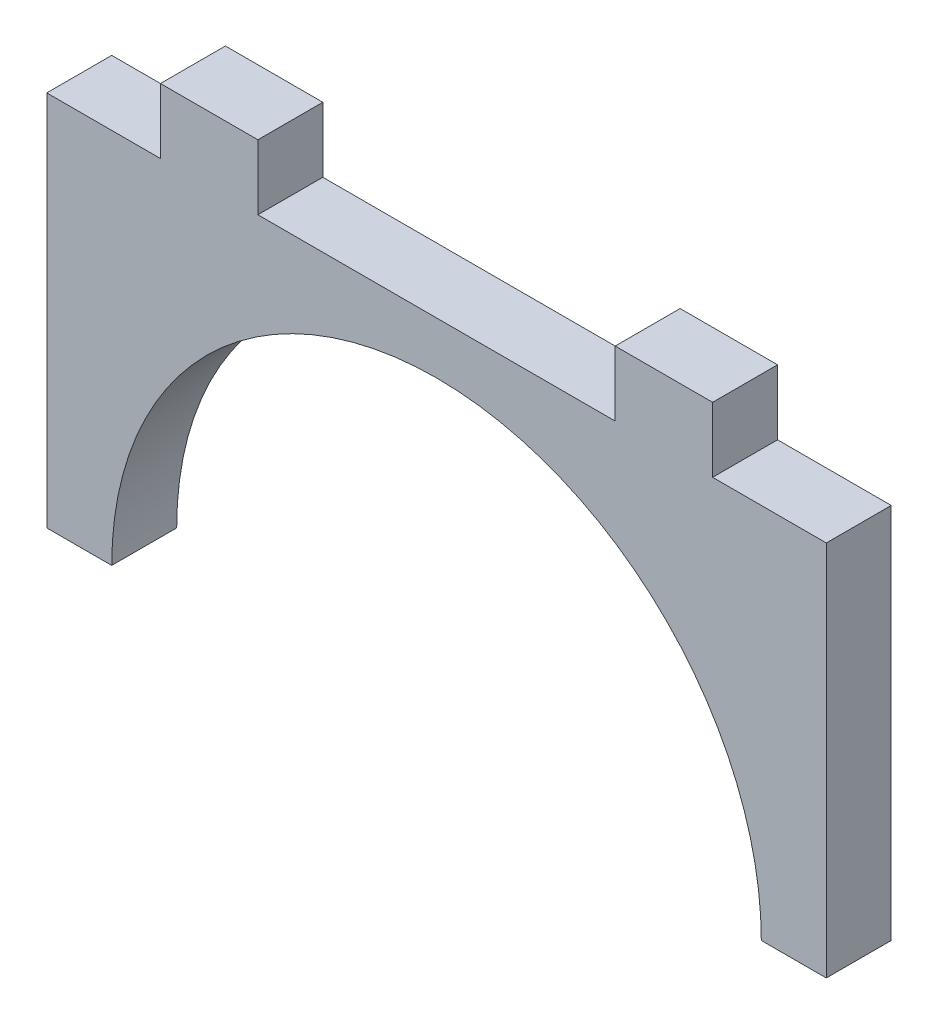
ISO-10303-21;
HEADER;
FILE_DESCRIPTION(('STEP AP214'),'2;1');
FILE_NAME('part.step','',(''),(''),'','','');
FILE_SCHEMA(('AUTOMOTIVE_DESIGN { 1 0 10303 214 1 1 1 1 }'));
ENDSEC;
DATA;
#1=APPLICATION_CONTEXT('core data for automotive mechanical design processes');
#2=APPLICATION_PROTOCOL_DEFINITION('international standard','automotive_design',2000,#1);
#3=PRODUCT_CONTEXT('',#1,'mechanical');
#4=PRODUCT('Part','Part','',(#3));
#5=PRODUCT_RELATED_PRODUCT_CATEGORY('part','',(#4));
#6=PRODUCT_DEFINITION_FORMATION('','',#4);
#7=PRODUCT_DEFINITION_CONTEXT('part definition',#1,'design');
#8=PRODUCT_DEFINITION('design','',#6,#7);
#9=PRODUCT_DEFINITION_SHAPE('','',#8);
#10=(LENGTH_UNIT() NAMED_UNIT(*) SI_UNIT(.MILLI.,.METRE.));
#11=(NAMED_UNIT(*) PLANE_ANGLE_UNIT() SI_UNIT($,.RADIAN.));
#12=(NAMED_UNIT(*) SI_UNIT($,.STERADIAN.) SOLID_ANGLE_UNIT());
#13=UNCERTAINTY_MEASURE_WITH_UNIT(LENGTH_MEASURE(1.E-05),#10,'distance_accuracy_value','');
#14=(GEOMETRIC_REPRESENTATION_CONTEXT(3) GLOBAL_UNCERTAINTY_ASSIGNED_CONTEXT((#13)) GLOBAL_UNIT_ASSIGNED_CONTEXT((#10,
#11,#12)) REPRESENTATION_CONTEXT('',''));
#15=CARTESIAN_POINT('',(0.,0.,0.));
#16=DIRECTION('',(0.,0.,1.));
#17=DIRECTION('',(1.,0.,0.));
#18=AXIS2_PLACEMENT_3D('',#15,#16,#17);
#19=CARTESIAN_POINT('',(0.,142.24,-12.7));
#20=DIRECTION('',(0.,0.,1.));
#21=DIRECTION('',(1.,0.,0.));
#22=AXIS2_PLACEMENT_3D('',#19,#20,#21);
#23=CYLINDRICAL_SURFACE('',#22,63.5);
#24=CARTESIAN_POINT('',(0.,142.24,0.));
#25=DIRECTION('',(0.,0.,1.));
#26=DIRECTION('',(1.,0.,0.));
#27=AXIS2_PLACEMENT_3D('',#24,#25,#26);
#28=CIRCLE('',#27,63.5);
#29=CARTESIAN_POINT('',(63.5,142.24,0.));
#30=VERTEX_POINT('',#29);
#31=CARTESIAN_POINT('',(-63.5,142.24,0.));
#32=VERTEX_POINT('',#31);
#33=EDGE_CURVE('E165',#30,#32,#28,.T.);
#34=ORIENTED_EDGE('',*,*,#33,.T.);
#35=DIRECTION('',(0.,0.,1.));
#36=VECTOR('',#35,1.);
#37=CARTESIAN_POINT('',(-63.5,142.24,-12.7));
#38=LINE('',#37,#36);
#39=CARTESIAN_POINT('',(-63.5,142.24,-12.7));
#40=VERTEX_POINT('',#39);
#41=EDGE_CURVE('E11',#40,#32,#38,.T.);
#42=ORIENTED_EDGE('',*,*,#41,.F.);
#43=CARTESIAN_POINT('',(0.,142.24,-12.7));
#44=DIRECTION('',(0.,0.,1.));
#45=DIRECTION('',(1.,0.,0.));
#46=AXIS2_PLACEMENT_3D('',#43,#44,#45);
#47=CIRCLE('',#46,63.5);
#48=CARTESIAN_POINT('',(63.5,142.24,-12.7));
#49=VERTEX_POINT('',#48);
#50=EDGE_CURVE('E198',#49,#40,#47,.T.);
#51=ORIENTED_EDGE('',*,*,#50,.F.);
#52=DIRECTION('',(0.,0.,1.));
#53=VECTOR('',#52,1.);
#54=CARTESIAN_POINT('',(63.5,142.24,-12.7));
#55=LINE('',#54,#53);
#56=EDGE_CURVE('E36',#49,#30,#55,.T.);
#57=ORIENTED_EDGE('',*,*,#56,.T.);
#58=EDGE_LOOP('',(#34,#42,#51,#57));
#59=FACE_BOUND('',#58,.T.);
#60=ADVANCED_FACE('F33',(#59),#23,.F.);
#61=CARTESIAN_POINT('',(-0.549995359405287,142.24,-12.7));
#62=DIRECTION('',(0.,1.,0.));
#63=DIRECTION('',(0.,0.,1.));
#64=AXIS2_PLACEMENT_3D('',#61,#62,#63);
#65=PLANE('',#64);
#66=DIRECTION('',(-1.,0.,0.));
#67=VECTOR('',#66,1.);
#68=CARTESIAN_POINT('',(-0.549995359405287,142.24,0.));
#69=LINE('',#68,#67);
#70=CARTESIAN_POINT('',(-76.2,142.24,0.));
#71=VERTEX_POINT('',#70);
#72=EDGE_CURVE('E94',#32,#71,#69,.T.);
#73=ORIENTED_EDGE('',*,*,#72,.T.);
#74=DIRECTION('',(0.,0.,1.));
#75=VECTOR('',#74,1.);
#76=CARTESIAN_POINT('',(-76.2,142.24,-12.7));
#77=LINE('',#76,#75);
#78=CARTESIAN_POINT('',(-76.2,142.24,-12.7));
#79=VERTEX_POINT('',#78);
#80=EDGE_CURVE('E42',#79,#71,#77,.T.);
#81=ORIENTED_EDGE('',*,*,#80,.F.);
#82=DIRECTION('',(-1.,0.,0.));
#83=VECTOR('',#82,1.);
#84=CARTESIAN_POINT('',(-0.549995359405287,142.24,-12.7));
#85=LINE('',#84,#83);
#86=EDGE_CURVE('E50',#40,#79,#85,.T.);
#87=ORIENTED_EDGE('',*,*,#86,.F.);
#88=ORIENTED_EDGE('',*,*,#41,.T.);
#89=EDGE_LOOP('',(#73,#81,#87,#88));
#90=FACE_BOUND('',#89,.T.);
#91=ADVANCED_FACE('F286',(#90),#65,.F.);
#92=CARTESIAN_POINT('',(-76.2,46.5973488707267,-12.7));
#93=DIRECTION('',(1.,0.,0.));
#94=DIRECTION('',(0.,1.,0.));
#95=AXIS2_PLACEMENT_3D('',#92,#93,#94);
#96=PLANE('',#95);
#97=DIRECTION('',(0.,1.,0.));
#98=VECTOR('',#97,1.);
#99=CARTESIAN_POINT('',(-76.2,46.5973488707267,0.));
#100=LINE('',#99,#98);
#101=CARTESIAN_POINT('',(-76.2,215.9,0.));
#102=VERTEX_POINT('',#101);
#103=EDGE_CURVE('E150',#71,#102,#100,.T.);
#104=ORIENTED_EDGE('',*,*,#103,.T.);
#105=DIRECTION('',(0.,0.,1.));
#106=VECTOR('',#105,1.);
#107=CARTESIAN_POINT('',(-76.2,215.9,-12.7));
#108=LINE('',#107,#106);
#109=CARTESIAN_POINT('',(-76.2,215.9,-12.7));
#110=VERTEX_POINT('',#109);
#111=EDGE_CURVE('E148',#110,#102,#108,.T.);
#112=ORIENTED_EDGE('',*,*,#111,.F.);
#113=DIRECTION('',(0.,1.,0.));
#114=VECTOR('',#113,1.);
#115=CARTESIAN_POINT('',(-76.2,46.5973488707267,-12.7));
#116=LINE('',#115,#114);
#117=EDGE_CURVE('E140',#79,#110,#116,.T.);
#118=ORIENTED_EDGE('',*,*,#117,.F.);
#119=ORIENTED_EDGE('',*,*,#80,.T.);
#120=EDGE_LOOP('',(#104,#112,#118,#119));
#121=FACE_BOUND('',#120,.T.);
#122=ADVANCED_FACE('F149',(#121),#96,.F.);
#123=CARTESIAN_POINT('',(-0.54999535940571,215.9,-12.7));
#124=DIRECTION('',(0.,1.,0.));
#125=DIRECTION('',(-1.,0.,0.));
#126=AXIS2_PLACEMENT_3D('',#123,#124,#125);
#127=PLANE('',#126);
#128=DIRECTION('',(-1.,0.,0.));
#129=VECTOR('',#128,1.);
#130=CARTESIAN_POINT('',(-0.54999535940571,215.9,0.));
#131=LINE('',#130,#129);
#132=CARTESIAN_POINT('',(-53.975,215.9,0.));
#133=VERTEX_POINT('',#132);
#134=EDGE_CURVE('E195',#133,#102,#131,.T.);
#135=ORIENTED_EDGE('',*,*,#134,.F.);
#136=DIRECTION('',(0.,0.,1.));
#137=VECTOR('',#136,1.);
#138=CARTESIAN_POINT('',(-53.975,215.9,-12.7));
#139=LINE('',#138,#137);
#140=CARTESIAN_POINT('',(-53.975,215.9,-12.7));
#141=VERTEX_POINT('',#140);
#142=EDGE_CURVE('E154',#141,#133,#139,.T.);
#143=ORIENTED_EDGE('',*,*,#142,.F.);
#144=DIRECTION('',(-1.,0.,0.));
#145=VECTOR('',#144,1.);
#146=CARTESIAN_POINT('',(-0.54999535940571,215.9,-12.7));
#147=LINE('',#146,#145);
#148=EDGE_CURVE('E144',#141,#110,#147,.T.);
#149=ORIENTED_EDGE('',*,*,#148,.T.);
#150=ORIENTED_EDGE('',*,*,#111,.T.);
#151=EDGE_LOOP('',(#135,#143,#149,#150));
#152=FACE_BOUND('',#151,.T.);
#153=ADVANCED_FACE('F156',(#152),#127,.T.);
#154=CARTESIAN_POINT('',(-53.9749999999999,46.5973488707266,-12.7));
#155=DIRECTION('',(1.,0.,0.));
#156=DIRECTION('',(0.,1.,0.));
#157=AXIS2_PLACEMENT_3D('',#154,#155,#156);
#158=PLANE('',#157);
#159=DIRECTION('',(0.,1.,0.));
#160=VECTOR('',#159,1.);
#161=CARTESIAN_POINT('',(-53.9749999999999,46.5973488707266,0.));
#162=LINE('',#161,#160);
#163=CARTESIAN_POINT('',(-53.975,228.6,0.));
#164=VERTEX_POINT('',#163);
#165=EDGE_CURVE('E193',#133,#164,#162,.T.);
#166=ORIENTED_EDGE('',*,*,#165,.T.);
#167=DIRECTION('',(0.,0.,1.));
#168=VECTOR('',#167,1.);
#169=CARTESIAN_POINT('',(-53.975,228.6,-12.7));
#170=LINE('',#169,#168);
#171=CARTESIAN_POINT('',(-53.975,228.6,-12.7));
#172=VERTEX_POINT('',#171);
#173=EDGE_CURVE('E202',#172,#164,#170,.T.);
#174=ORIENTED_EDGE('',*,*,#173,.F.);
#175=DIRECTION('',(0.,1.,0.));
#176=VECTOR('',#175,1.);
#177=CARTESIAN_POINT('',(-53.9749999999999,46.5973488707266,-12.7));
#178=LINE('',#177,#176);
#179=EDGE_CURVE('E158',#141,#172,#178,.T.);
#180=ORIENTED_EDGE('',*,*,#179,.F.);
#181=ORIENTED_EDGE('',*,*,#142,.T.);
#182=EDGE_LOOP('',(#166,#174,#180,#181));
#183=FACE_BOUND('',#182,.T.);
#184=ADVANCED_FACE('F274',(#183),#158,.F.);
#185=CARTESIAN_POINT('',(-0.549995359405287,228.6,-12.7));
#186=DIRECTION('',(0.,-1.,0.));
#187=DIRECTION('',(0.,0.,-1.));
#188=AXIS2_PLACEMENT_3D('',#185,#186,#187);
#189=PLANE('',#188);
#190=DIRECTION('',(1.,0.,0.));
#191=VECTOR('',#190,1.);
#192=CARTESIAN_POINT('',(-0.549995359405287,228.6,0.));
#193=LINE('',#192,#191);
#194=CARTESIAN_POINT('',(-34.925,228.6,0.));
#195=VERTEX_POINT('',#194);
#196=EDGE_CURVE('E190',#164,#195,#193,.T.);
#197=ORIENTED_EDGE('',*,*,#196,.T.);
#198=DIRECTION('',(0.,0.,1.));
#199=VECTOR('',#198,1.);
#200=CARTESIAN_POINT('',(-34.925,228.6,-12.7));
#201=LINE('',#200,#199);
#202=CARTESIAN_POINT('',(-34.925,228.6,-12.7));
#203=VERTEX_POINT('',#202);
#204=EDGE_CURVE('E205',#203,#195,#201,.T.);
#205=ORIENTED_EDGE('',*,*,#204,.F.);
#206=DIRECTION('',(1.,0.,0.));
#207=VECTOR('',#206,1.);
#208=CARTESIAN_POINT('',(-0.549995359405287,228.6,-12.7));
#209=LINE('',#208,#207);
#210=EDGE_CURVE('E160',#172,#203,#209,.T.);
#211=ORIENTED_EDGE('',*,*,#210,.F.);
#212=ORIENTED_EDGE('',*,*,#173,.T.);
#213=EDGE_LOOP('',(#197,#205,#211,#212));
#214=FACE_BOUND('',#213,.T.);
#215=ADVANCED_FACE('F270',(#214),#189,.F.);
#216=CARTESIAN_POINT('',(-34.925,46.5973488707267,-12.7));
#217=DIRECTION('',(1.,0.,0.));
#218=DIRECTION('',(0.,0.,-1.));
#219=AXIS2_PLACEMENT_3D('',#216,#217,#218);
#220=PLANE('',#219);
#221=DIRECTION('',(0.,1.,0.));
#222=VECTOR('',#221,1.);
#223=CARTESIAN_POINT('',(-34.925,46.5973488707267,0.));
#224=LINE('',#223,#222);
#225=CARTESIAN_POINT('',(-34.925,215.9,0.));
#226=VERTEX_POINT('',#225);
#227=EDGE_CURVE('E187',#226,#195,#224,.T.);
#228=ORIENTED_EDGE('',*,*,#227,.F.);
#229=DIRECTION('',(0.,0.,1.));
#230=VECTOR('',#229,1.);
#231=CARTESIAN_POINT('',(-34.925,215.9,-12.7));
#232=LINE('',#231,#230);
#233=CARTESIAN_POINT('',(-34.925,215.9,-12.7));
#234=VERTEX_POINT('',#233);
#235=EDGE_CURVE('E207',#234,#226,#232,.T.);
#236=ORIENTED_EDGE('',*,*,#235,.F.);
#237=DIRECTION('',(0.,1.,0.));
#238=VECTOR('',#237,1.);
#239=CARTESIAN_POINT('',(-34.925,46.5973488707267,-12.7));
#240=LINE('',#239,#238);
#241=EDGE_CURVE('E275',#234,#203,#240,.T.);
#242=ORIENTED_EDGE('',*,*,#241,.T.);
#243=ORIENTED_EDGE('',*,*,#204,.T.);
#244=EDGE_LOOP('',(#228,#236,#242,#243));
#245=FACE_BOUND('',#244,.T.);
#246=ADVANCED_FACE('F265',(#245),#220,.T.);
#247=CARTESIAN_POINT('',(-0.549995359405287,215.9,-12.7));
#248=DIRECTION('',(0.,1.,0.));
#249=DIRECTION('',(0.,0.,1.));
#250=AXIS2_PLACEMENT_3D('',#247,#248,#249);
#251=PLANE('',#250);
#252=DIRECTION('',(-1.,0.,0.));
#253=VECTOR('',#252,1.);
#254=CARTESIAN_POINT('',(-0.549995359405287,215.9,0.));
#255=LINE('',#254,#253);
#256=CARTESIAN_POINT('',(34.925,215.9,0.));
#257=VERTEX_POINT('',#256);
#258=EDGE_CURVE('E184',#257,#226,#255,.T.);
#259=ORIENTED_EDGE('',*,*,#258,.F.);
#260=DIRECTION('',(0.,0.,1.));
#261=VECTOR('',#260,1.);
#262=CARTESIAN_POINT('',(34.925,215.9,-12.7));
#263=LINE('',#262,#261);
#264=CARTESIAN_POINT('',(34.925,215.9,-12.7));
#265=VERTEX_POINT('',#264);
#266=EDGE_CURVE('E209',#265,#257,#263,.T.);
#267=ORIENTED_EDGE('',*,*,#266,.F.);
#268=DIRECTION('',(-1.,0.,0.));
#269=VECTOR('',#268,1.);
#270=CARTESIAN_POINT('',(-0.549995359405287,215.9,-12.7));
#271=LINE('',#270,#269);
#272=EDGE_CURVE('E261',#265,#234,#271,.T.);
#273=ORIENTED_EDGE('',*,*,#272,.T.);
#274=ORIENTED_EDGE('',*,*,#235,.T.);
#275=EDGE_LOOP('',(#259,#267,#273,#274));
#276=FACE_BOUND('',#275,.T.);
#277=ADVANCED_FACE('F258',(#276),#251,.T.);
#278=CARTESIAN_POINT('',(34.925,46.5973488707267,-12.7));
#279=DIRECTION('',(1.,0.,0.));
#280=DIRECTION('',(0.,0.,-1.));
#281=AXIS2_PLACEMENT_3D('',#278,#279,#280);
#282=PLANE('',#281);
#283=DIRECTION('',(0.,1.,0.));
#284=VECTOR('',#283,1.);
#285=CARTESIAN_POINT('',(34.925,46.5973488707267,0.));
#286=LINE('',#285,#284);
#287=CARTESIAN_POINT('',(34.925,228.6,0.));
#288=VERTEX_POINT('',#287);
#289=EDGE_CURVE('E182',#257,#288,#286,.T.);
#290=ORIENTED_EDGE('',*,*,#289,.T.);
#291=DIRECTION('',(0.,0.,1.));
#292=VECTOR('',#291,1.);
#293=CARTESIAN_POINT('',(34.925,228.6,-12.7));
#294=LINE('',#293,#292);
#295=CARTESIAN_POINT('',(34.925,228.6,-12.7));
#296=VERTEX_POINT('',#295);
#297=EDGE_CURVE('E211',#296,#288,#294,.T.);
#298=ORIENTED_EDGE('',*,*,#297,.F.);
#299=DIRECTION('',(0.,1.,0.));
#300=VECTOR('',#299,1.);
#301=CARTESIAN_POINT('',(34.925,46.5973488707267,-12.7));
#302=LINE('',#301,#300);
#303=EDGE_CURVE('E254',#265,#296,#302,.T.);
#304=ORIENTED_EDGE('',*,*,#303,.F.);
#305=ORIENTED_EDGE('',*,*,#266,.T.);
#306=EDGE_LOOP('',(#290,#298,#304,#305));
#307=FACE_BOUND('',#306,.T.);
#308=ADVANCED_FACE('F253',(#307),#282,.F.);
#309=CARTESIAN_POINT('',(-0.549995359405287,228.6,-12.7));
#310=DIRECTION('',(0.,-1.,0.));
#311=DIRECTION('',(0.,0.,-1.));
#312=AXIS2_PLACEMENT_3D('',#309,#310,#311);
#313=PLANE('',#312);
#314=DIRECTION('',(1.,0.,0.));
#315=VECTOR('',#314,1.);
#316=CARTESIAN_POINT('',(-0.549995359405287,228.6,0.));
#317=LINE('',#316,#315);
#318=CARTESIAN_POINT('',(53.975,228.6,0.));
#319=VERTEX_POINT('',#318);
#320=EDGE_CURVE('E179',#288,#319,#317,.T.);
#321=ORIENTED_EDGE('',*,*,#320,.T.);
#322=DIRECTION('',(0.,0.,1.));
#323=VECTOR('',#322,1.);
#324=CARTESIAN_POINT('',(53.975,228.6,-12.7));
#325=LINE('',#324,#323);
#326=CARTESIAN_POINT('',(53.975,228.6,-12.7));
#327=VERTEX_POINT('',#326);
#328=EDGE_CURVE('E214',#327,#319,#325,.T.);
#329=ORIENTED_EDGE('',*,*,#328,.F.);
#330=DIRECTION('',(1.,0.,0.));
#331=VECTOR('',#330,1.);
#332=CARTESIAN_POINT('',(-0.549995359405287,228.6,-12.7));
#333=LINE('',#332,#331);
#334=EDGE_CURVE('E250',#296,#327,#333,.T.);
#335=ORIENTED_EDGE('',*,*,#334,.F.);
#336=ORIENTED_EDGE('',*,*,#297,.T.);
#337=EDGE_LOOP('',(#321,#329,#335,#336));
#338=FACE_BOUND('',#337,.T.);
#339=ADVANCED_FACE('F248',(#338),#313,.F.);
#340=CARTESIAN_POINT('',(53.975,46.5973488707267,-12.7));
#341=DIRECTION('',(1.,0.,0.));
#342=DIRECTION('',(0.,0.,-1.));
#343=AXIS2_PLACEMENT_3D('',#340,#341,#342);
#344=PLANE('',#343);
#345=DIRECTION('',(0.,1.,0.));
#346=VECTOR('',#345,1.);
#347=CARTESIAN_POINT('',(53.975,46.5973488707267,0.));
#348=LINE('',#347,#346);
#349=CARTESIAN_POINT('',(53.975,215.9,0.));
#350=VERTEX_POINT('',#349);
#351=EDGE_CURVE('E176',#350,#319,#348,.T.);
#352=ORIENTED_EDGE('',*,*,#351,.F.);
#353=DIRECTION('',(0.,0.,1.));
#354=VECTOR('',#353,1.);
#355=CARTESIAN_POINT('',(53.975,215.9,-12.7));
#356=LINE('',#355,#354);
#357=CARTESIAN_POINT('',(53.975,215.9,-12.7));
#358=VERTEX_POINT('',#357);
#359=EDGE_CURVE('E216',#358,#350,#356,.T.);
#360=ORIENTED_EDGE('',*,*,#359,.F.);
#361=DIRECTION('',(0.,1.,0.));
#362=VECTOR('',#361,1.);
#363=CARTESIAN_POINT('',(53.975,46.5973488707267,-12.7));
#364=LINE('',#363,#362);
#365=EDGE_CURVE('E245',#358,#327,#364,.T.);
#366=ORIENTED_EDGE('',*,*,#365,.T.);
#367=ORIENTED_EDGE('',*,*,#328,.T.);
#368=EDGE_LOOP('',(#352,#360,#366,#367));
#369=FACE_BOUND('',#368,.T.);
#370=ADVANCED_FACE('F241',(#369),#344,.T.);
#371=CARTESIAN_POINT('',(-0.549995359405076,215.9,-12.7));
#372=DIRECTION('',(0.,1.,0.));
#373=DIRECTION('',(-1.,0.,0.));
#374=AXIS2_PLACEMENT_3D('',#371,#372,#373);
#375=PLANE('',#374);
#376=DIRECTION('',(-1.,0.,0.));
#377=VECTOR('',#376,1.);
#378=CARTESIAN_POINT('',(-0.549995359405076,215.9,0.));
#379=LINE('',#378,#377);
#380=CARTESIAN_POINT('',(76.2,215.9,0.));
#381=VERTEX_POINT('',#380);
#382=EDGE_CURVE('E173',#381,#350,#379,.T.);
#383=ORIENTED_EDGE('',*,*,#382,.F.);
#384=DIRECTION('',(0.,0.,1.));
#385=VECTOR('',#384,1.);
#386=CARTESIAN_POINT('',(76.2,215.9,-12.7));
#387=LINE('',#386,#385);
#388=CARTESIAN_POINT('',(76.2,215.9,-12.7));
#389=VERTEX_POINT('',#388);
#390=EDGE_CURVE('E218',#389,#381,#387,.T.);
#391=ORIENTED_EDGE('',*,*,#390,.F.);
#392=DIRECTION('',(-1.,0.,0.));
#393=VECTOR('',#392,1.);
#394=CARTESIAN_POINT('',(-0.549995359405076,215.9,-12.7));
#395=LINE('',#394,#393);
#396=EDGE_CURVE('E282',#389,#358,#395,.T.);
#397=ORIENTED_EDGE('',*,*,#396,.T.);
#398=ORIENTED_EDGE('',*,*,#359,.T.);
#399=EDGE_LOOP('',(#383,#391,#397,#398));
#400=FACE_BOUND('',#399,.T.);
#401=ADVANCED_FACE('F236',(#400),#375,.T.);
#402=CARTESIAN_POINT('',(76.2,46.5973488707267,-12.7));
#403=DIRECTION('',(1.,0.,0.));
#404=DIRECTION('',(0.,1.,0.));
#405=AXIS2_PLACEMENT_3D('',#402,#403,#404);
#406=PLANE('',#405);
#407=DIRECTION('',(0.,1.,0.));
#408=VECTOR('',#407,1.);
#409=CARTESIAN_POINT('',(76.2,46.5973488707267,0.));
#410=LINE('',#409,#408);
#411=CARTESIAN_POINT('',(76.2,142.24,0.));
#412=VERTEX_POINT('',#411);
#413=EDGE_CURVE('E170',#412,#381,#410,.T.);
#414=ORIENTED_EDGE('',*,*,#413,.F.);
#415=DIRECTION('',(0.,0.,1.));
#416=VECTOR('',#415,1.);
#417=CARTESIAN_POINT('',(76.2,142.24,-12.7));
#418=LINE('',#417,#416);
#419=CARTESIAN_POINT('',(76.2,142.24,-12.7));
#420=VERTEX_POINT('',#419);
#421=EDGE_CURVE('E219',#420,#412,#418,.T.);
#422=ORIENTED_EDGE('',*,*,#421,.F.);
#423=DIRECTION('',(0.,1.,0.));
#424=VECTOR('',#423,1.);
#425=CARTESIAN_POINT('',(76.2,46.5973488707267,-12.7));
#426=LINE('',#425,#424);
#427=EDGE_CURVE('E232',#420,#389,#426,.T.);
#428=ORIENTED_EDGE('',*,*,#427,.T.);
#429=ORIENTED_EDGE('',*,*,#390,.T.);
#430=EDGE_LOOP('',(#414,#422,#428,#429));
#431=FACE_BOUND('',#430,.T.);
#432=ADVANCED_FACE('F229',(#431),#406,.T.);
#433=CARTESIAN_POINT('',(-0.549995359405287,142.24,-12.7));
#434=DIRECTION('',(0.,1.,0.));
#435=DIRECTION('',(0.,0.,1.));
#436=AXIS2_PLACEMENT_3D('',#433,#434,#435);
#437=PLANE('',#436);
#438=DIRECTION('',(-1.,0.,0.));
#439=VECTOR('',#438,1.);
#440=CARTESIAN_POINT('',(-0.549995359405287,142.24,0.));
#441=LINE('',#440,#439);
#442=EDGE_CURVE('E168',#412,#30,#441,.T.);
#443=ORIENTED_EDGE('',*,*,#442,.T.);
#444=ORIENTED_EDGE('',*,*,#56,.F.);
#445=DIRECTION('',(-1.,0.,0.));
#446=VECTOR('',#445,1.);
#447=CARTESIAN_POINT('',(-0.549995359405287,142.24,-12.7));
#448=LINE('',#447,#446);
#449=EDGE_CURVE('E106',#420,#49,#448,.T.);
#450=ORIENTED_EDGE('',*,*,#449,.F.);
#451=ORIENTED_EDGE('',*,*,#421,.T.);
#452=EDGE_LOOP('',(#443,#444,#450,#451));
#453=FACE_BOUND('',#452,.T.);
#454=ADVANCED_FACE('F316',(#453),#437,.F.);
#455=CARTESIAN_POINT('',(-0.549995359405287,46.5973488707267,-12.7));
#456=DIRECTION('',(0.,0.,1.));
#457=DIRECTION('',(1.,0.,0.));
#458=AXIS2_PLACEMENT_3D('',#455,#456,#457);
#459=PLANE('',#458);
#460=ORIENTED_EDGE('',*,*,#50,.T.);
#461=ORIENTED_EDGE('',*,*,#86,.T.);
#462=ORIENTED_EDGE('',*,*,#117,.T.);
#463=ORIENTED_EDGE('',*,*,#148,.F.);
#464=ORIENTED_EDGE('',*,*,#179,.T.);
#465=ORIENTED_EDGE('',*,*,#210,.T.);
#466=ORIENTED_EDGE('',*,*,#241,.F.);
#467=ORIENTED_EDGE('',*,*,#272,.F.);
#468=ORIENTED_EDGE('',*,*,#303,.T.);
#469=ORIENTED_EDGE('',*,*,#334,.T.);
#470=ORIENTED_EDGE('',*,*,#365,.F.);
#471=ORIENTED_EDGE('',*,*,#396,.F.);
#472=ORIENTED_EDGE('',*,*,#427,.F.);
#473=ORIENTED_EDGE('',*,*,#449,.T.);
#474=EDGE_LOOP('',(#460,#461,#462,#463,#464,#465,#466,#467,#468,#469,#470,#471,#472,#473));
#475=FACE_BOUND('',#474,.T.);
#476=ADVANCED_FACE('F142',(#475),#459,.F.);
#477=CARTESIAN_POINT('',(-0.549995359405287,46.5973488707267,0.));
#478=DIRECTION('',(0.,0.,1.));
#479=DIRECTION('',(1.,0.,0.));
#480=AXIS2_PLACEMENT_3D('',#477,#478,#479);
#481=PLANE('',#480);
#482=ORIENTED_EDGE('',*,*,#33,.F.);
#483=ORIENTED_EDGE('',*,*,#442,.F.);
#484=ORIENTED_EDGE('',*,*,#413,.T.);
#485=ORIENTED_EDGE('',*,*,#382,.T.);
#486=ORIENTED_EDGE('',*,*,#351,.T.);
#487=ORIENTED_EDGE('',*,*,#320,.F.);
#488=ORIENTED_EDGE('',*,*,#289,.F.);
#489=ORIENTED_EDGE('',*,*,#258,.T.);
#490=ORIENTED_EDGE('',*,*,#227,.T.);
#491=ORIENTED_EDGE('',*,*,#196,.F.);
#492=ORIENTED_EDGE('',*,*,#165,.F.);
#493=ORIENTED_EDGE('',*,*,#134,.T.);
#494=ORIENTED_EDGE('',*,*,#103,.F.);
#495=ORIENTED_EDGE('',*,*,#72,.F.);
#496=EDGE_LOOP('',(#482,#483,#484,#485,#486,#487,#488,#489,#490,#491,#492,#493,#494,#495));
#497=FACE_BOUND('',#496,.T.);
#498=ADVANCED_FACE('F226',(#497),#481,.T.);
#499=CLOSED_SHELL('',(#60,#91,#122,#153,#184,#215,#246,#277,#308,#339,#370,#401,#432,#454,#476,#498));
#500=MANIFOLD_SOLID_BREP('B2',#499);
#501=ADVANCED_BREP_SHAPE_REPRESENTATION('',(#18,#500),#14);
#502=SHAPE_DEFINITION_REPRESENTATION(#9,#501);
ENDSEC;
END-ISO-10303-21;
